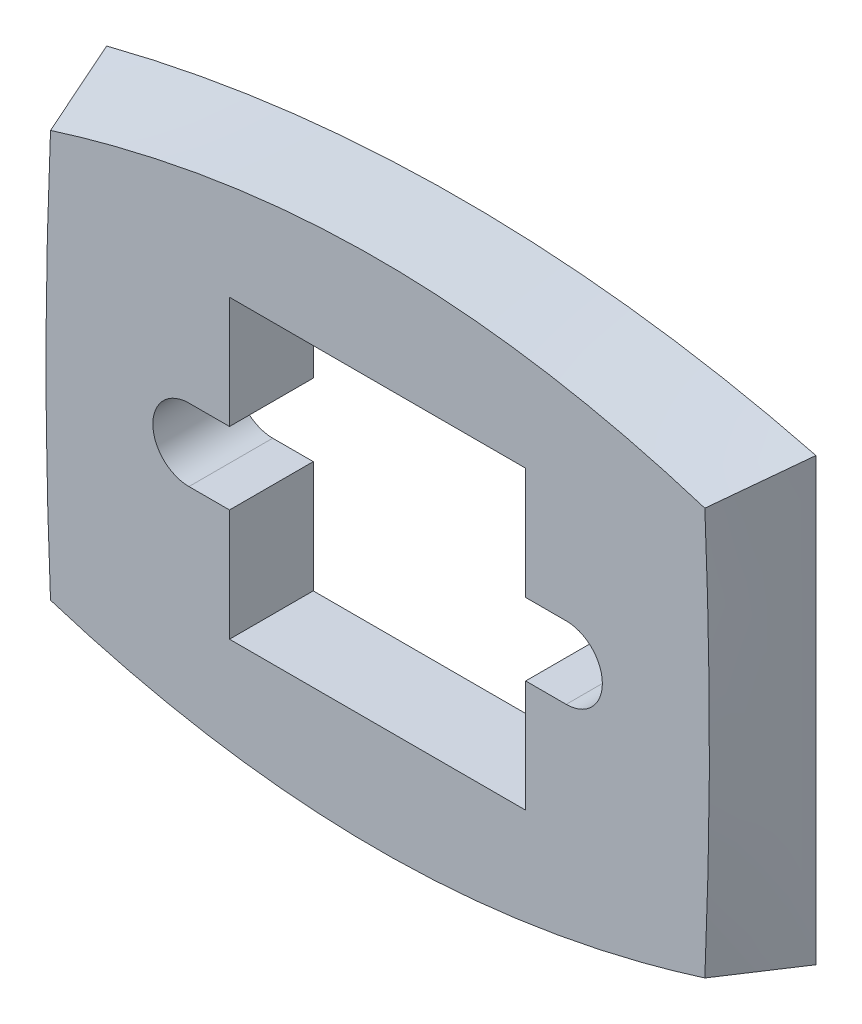
ISO-10303-21;
HEADER;
FILE_DESCRIPTION(('STEP AP214'),'2;1');
FILE_NAME('part.step','',(''),(''),'','','');
FILE_SCHEMA(('AUTOMOTIVE_DESIGN { 1 0 10303 214 1 1 1 1 }'));
ENDSEC;
DATA;
#1=APPLICATION_CONTEXT('core data for automotive mechanical design processes');
#2=APPLICATION_PROTOCOL_DEFINITION('international standard','automotive_design',2000,#1);
#3=PRODUCT_CONTEXT('',#1,'mechanical');
#4=PRODUCT('Part','Part','',(#3));
#5=PRODUCT_RELATED_PRODUCT_CATEGORY('part','',(#4));
#6=PRODUCT_DEFINITION_FORMATION('','',#4);
#7=PRODUCT_DEFINITION_CONTEXT('part definition',#1,'design');
#8=PRODUCT_DEFINITION('design','',#6,#7);
#9=PRODUCT_DEFINITION_SHAPE('','',#8);
#10=(LENGTH_UNIT() NAMED_UNIT(*) SI_UNIT(.MILLI.,.METRE.));
#11=(NAMED_UNIT(*) PLANE_ANGLE_UNIT() SI_UNIT($,.RADIAN.));
#12=(NAMED_UNIT(*) SI_UNIT($,.STERADIAN.) SOLID_ANGLE_UNIT());
#13=UNCERTAINTY_MEASURE_WITH_UNIT(LENGTH_MEASURE(1.E-05),#10,'distance_accuracy_value','');
#14=(GEOMETRIC_REPRESENTATION_CONTEXT(3) GLOBAL_UNCERTAINTY_ASSIGNED_CONTEXT((#13)) GLOBAL_UNIT_ASSIGNED_CONTEXT((#10,
#11,#12)) REPRESENTATION_CONTEXT('',''));
#15=CARTESIAN_POINT('',(0.,0.,0.));
#16=DIRECTION('',(0.,0.,1.));
#17=DIRECTION('',(1.,0.,0.));
#18=AXIS2_PLACEMENT_3D('',#15,#16,#17);
#19=CARTESIAN_POINT('',(0.,65.883028,0.));
#20=DIRECTION('',(0.,0.,1.));
#21=DIRECTION('',(1.,0.,0.));
#22=AXIS2_PLACEMENT_3D('',#19,#20,#21);
#23=PLANE('',#22);
#24=DIRECTION('',(-1.,0.,0.));
#25=VECTOR('',#24,1.);
#26=CARTESIAN_POINT('',(-39.2238839683323,-2.05000000000002,0.));
#27=LINE('',#26,#25);
#28=CARTESIAN_POINT('',(10.7,-2.05000000000002,0.));
#29=VERTEX_POINT('',#28);
#30=CARTESIAN_POINT('',(8.39999999999998,-2.05000000000002,0.));
#31=VERTEX_POINT('',#30);
#32=EDGE_CURVE('E417',#29,#31,#27,.T.);
#33=ORIENTED_EDGE('',*,*,#32,.F.);
#34=CARTESIAN_POINT('',(10.7,0.,0.));
#35=DIRECTION('',(0.,0.,-1.));
#36=DIRECTION('',(-1.,0.,0.));
#37=AXIS2_PLACEMENT_3D('',#34,#35,#36);
#38=CIRCLE('',#37,2.05);
#39=CARTESIAN_POINT('',(10.7,2.04999999999998,0.));
#40=VERTEX_POINT('',#39);
#41=EDGE_CURVE('E418',#40,#29,#38,.T.);
#42=ORIENTED_EDGE('',*,*,#41,.F.);
#43=DIRECTION('',(1.,0.,0.));
#44=VECTOR('',#43,1.);
#45=CARTESIAN_POINT('',(-39.2238839683323,2.04999999999998,0.));
#46=LINE('',#45,#44);
#47=CARTESIAN_POINT('',(8.39999999999998,2.04999999999998,0.));
#48=VERTEX_POINT('',#47);
#49=EDGE_CURVE('E230',#48,#40,#46,.T.);
#50=ORIENTED_EDGE('',*,*,#49,.F.);
#51=DIRECTION('',(0.,-1.,0.));
#52=VECTOR('',#51,1.);
#53=CARTESIAN_POINT('',(8.39999999999998,0.,0.));
#54=LINE('',#53,#52);
#55=CARTESIAN_POINT('',(8.39999999999997,8.39999999999998,0.));
#56=VERTEX_POINT('',#55);
#57=EDGE_CURVE('E119',#56,#48,#54,.T.);
#58=ORIENTED_EDGE('',*,*,#57,.F.);
#59=DIRECTION('',(1.,0.,0.));
#60=VECTOR('',#59,1.);
#61=CARTESIAN_POINT('',(-39.2238839683323,8.39999999999998,0.));
#62=LINE('',#61,#60);
#63=CARTESIAN_POINT('',(-8.40000000000003,8.39999999999998,0.));
#64=VERTEX_POINT('',#63);
#65=EDGE_CURVE('E235',#64,#56,#62,.T.);
#66=ORIENTED_EDGE('',*,*,#65,.F.);
#67=DIRECTION('',(0.,1.,0.));
#68=VECTOR('',#67,1.);
#69=CARTESIAN_POINT('',(-8.40000000000003,0.,0.));
#70=LINE('',#69,#68);
#71=CARTESIAN_POINT('',(-8.40000000000003,2.04999999999998,0.));
#72=VERTEX_POINT('',#71);
#73=EDGE_CURVE('E444',#72,#64,#70,.T.);
#74=ORIENTED_EDGE('',*,*,#73,.F.);
#75=DIRECTION('',(1.,0.,0.));
#76=VECTOR('',#75,1.);
#77=CARTESIAN_POINT('',(-39.2238839683323,2.04999999999998,0.));
#78=LINE('',#77,#76);
#79=CARTESIAN_POINT('',(-10.7,2.04999999999998,0.));
#80=VERTEX_POINT('',#79);
#81=EDGE_CURVE('E441',#80,#72,#78,.T.);
#82=ORIENTED_EDGE('',*,*,#81,.F.);
#83=CARTESIAN_POINT('',(-10.7,0.,0.));
#84=DIRECTION('',(0.,0.,-1.));
#85=DIRECTION('',(-1.,0.,0.));
#86=AXIS2_PLACEMENT_3D('',#83,#84,#85);
#87=CIRCLE('',#86,2.05);
#88=CARTESIAN_POINT('',(-10.7,-2.05000000000002,0.));
#89=VERTEX_POINT('',#88);
#90=EDGE_CURVE('E438',#89,#80,#87,.T.);
#91=ORIENTED_EDGE('',*,*,#90,.F.);
#92=DIRECTION('',(-1.,0.,0.));
#93=VECTOR('',#92,1.);
#94=CARTESIAN_POINT('',(-39.2238839683323,-2.05000000000002,0.));
#95=LINE('',#94,#93);
#96=CARTESIAN_POINT('',(-8.40000000000003,-2.05000000000002,0.));
#97=VERTEX_POINT('',#96);
#98=EDGE_CURVE('E435',#97,#89,#95,.T.);
#99=ORIENTED_EDGE('',*,*,#98,.F.);
#100=DIRECTION('',(0.,1.,0.));
#101=VECTOR('',#100,1.);
#102=CARTESIAN_POINT('',(-8.40000000000003,0.,0.));
#103=LINE('',#102,#101);
#104=CARTESIAN_POINT('',(-8.40000000000003,-8.40000000000002,0.));
#105=VERTEX_POINT('',#104);
#106=EDGE_CURVE('E432',#105,#97,#103,.T.);
#107=ORIENTED_EDGE('',*,*,#106,.F.);
#108=DIRECTION('',(-1.,0.,0.));
#109=VECTOR('',#108,1.);
#110=CARTESIAN_POINT('',(-39.2238839683323,-8.40000000000002,0.));
#111=LINE('',#110,#109);
#112=CARTESIAN_POINT('',(8.39999999999998,-8.40000000000002,0.));
#113=VERTEX_POINT('',#112);
#114=EDGE_CURVE('E425',#113,#105,#111,.T.);
#115=ORIENTED_EDGE('',*,*,#114,.F.);
#116=DIRECTION('',(0.,-1.,0.));
#117=VECTOR('',#116,1.);
#118=CARTESIAN_POINT('',(8.39999999999998,0.,0.));
#119=LINE('',#118,#117);
#120=EDGE_CURVE('E421',#31,#113,#119,.T.);
#121=ORIENTED_EDGE('',*,*,#120,.F.);
#122=EDGE_LOOP('',(#33,#42,#50,#58,#66,#74,#82,#91,#99,#107,#115,#121));
#123=FACE_BOUND('',#122,.T.);
#124=CARTESIAN_POINT('',(0.,65.883028,0.));
#125=DIRECTION('',(0.,0.,1.));
#126=DIRECTION('',(1.,0.,0.));
#127=AXIS2_PLACEMENT_3D('',#124,#125,#126);
#128=CIRCLE('',#127,80.932528);
#129=CARTESIAN_POINT('',(-20.1168,-12.5095,0.));
#130=VERTEX_POINT('',#129);
#131=CARTESIAN_POINT('',(20.1168,-12.5095,0.));
#132=VERTEX_POINT('',#131);
#133=EDGE_CURVE('E266',#130,#132,#128,.T.);
#134=ORIENTED_EDGE('',*,*,#133,.F.);
#135=DIRECTION('',(0.,-1.,0.));
#136=VECTOR('',#135,1.);
#137=CARTESIAN_POINT('',(-20.1168,12.5095,0.));
#138=LINE('',#137,#136);
#139=CARTESIAN_POINT('',(-20.1168,12.5095,0.));
#140=VERTEX_POINT('',#139);
#141=EDGE_CURVE('E13',#140,#130,#138,.T.);
#142=ORIENTED_EDGE('',*,*,#141,.F.);
#143=CARTESIAN_POINT('',(0.,-65.883028,0.));
#144=DIRECTION('',(0.,0.,1.));
#145=DIRECTION('',(-1.,0.,0.));
#146=AXIS2_PLACEMENT_3D('',#143,#144,#145);
#147=CIRCLE('',#146,80.932528);
#148=CARTESIAN_POINT('',(20.1168,12.5095,0.));
#149=VERTEX_POINT('',#148);
#150=EDGE_CURVE('E103',#149,#140,#147,.T.);
#151=ORIENTED_EDGE('',*,*,#150,.F.);
#152=DIRECTION('',(0.,1.,0.));
#153=VECTOR('',#152,1.);
#154=CARTESIAN_POINT('',(20.1168,12.5095,0.));
#155=LINE('',#154,#153);
#156=EDGE_CURVE('E388',#132,#149,#155,.T.);
#157=ORIENTED_EDGE('',*,*,#156,.F.);
#158=EDGE_LOOP('',(#134,#142,#151,#157));
#159=FACE_BOUND('',#158,.T.);
#160=ADVANCED_FACE('F90',(#123,#159),#23,.F.);
#161=CARTESIAN_POINT('',(20.1168,-12.5095,0.));
#162=CARTESIAN_POINT('',(9.74177712979694,-6.17149057386721,31.75));
#163=CARTESIAN_POINT('',(20.1168,-10.4245833333333,0.));
#164=CARTESIAN_POINT('',(10.2730014330366,-5.31721717657622,31.75));
#165=CARTESIAN_POINT('',(20.1168,-8.33966666666667,0.));
#166=CARTESIAN_POINT('',(10.7102668571011,-4.35812536695142,31.75));
#167=CARTESIAN_POINT('',(20.1168,-4.16983333333333,0.));
#168=CARTESIAN_POINT('',(11.3070820380086,-2.31079947243594,31.75));
#169=CARTESIAN_POINT('',(20.1168,-2.08491666666667,0.));
#170=CARTESIAN_POINT('',(11.4654113174126,-1.22365941949708,31.75));
#171=CARTESIAN_POINT('',(20.1168,2.08491666666667,0.));
#172=CARTESIAN_POINT('',(11.4654113174126,0.95235797529623,31.75));
#173=CARTESIAN_POINT('',(20.1168,4.16983333333333,0.));
#174=CARTESIAN_POINT('',(11.3070820380086,2.03949802823509,31.75));
#175=CARTESIAN_POINT('',(20.1168,8.33966666666667,0.));
#176=CARTESIAN_POINT('',(10.7102668571011,4.08682392275058,31.75));
#177=CARTESIAN_POINT('',(20.1168,10.4245833333333,0.));
#178=CARTESIAN_POINT('',(10.2730014330366,5.04591573237537,31.75));
#179=CARTESIAN_POINT('',(20.1168,12.5095,0.));
#180=CARTESIAN_POINT('',(9.74177712979694,5.90018912966637,31.75));
#181=B_SPLINE_SURFACE_WITH_KNOTS('',3,1,((#161,#162),(#163,#164),(#165,#166),(#167,#168),(#169,
#170),(#171,#172),(#173,#174),(#175,#176),(#177,#178),(#179,#180)),.UNSPECIFIED.,.F.,.F.,.F.,(4,
2,2,2,4),(2,2),(0.,0.25,0.5,0.75,1.),(0.,1.),.UNSPECIFIED.);
#182=CARTESIAN_POINT('',(18.564631224142,-11.5612938653812,4.75000000000273));
#183=CARTESIAN_POINT('',(18.6077968784522,-10.5291794533806,4.75000000000273));
#184=CARTESIAN_POINT('',(18.6466142437702,-9.49686397620171,4.75000000000273));
#185=CARTESIAN_POINT('',(18.7137514789873,-7.43188701827835,4.75000000000273));
#186=CARTESIAN_POINT('',(18.7420712701301,-6.39922553499619,4.75000000000273));
#187=CARTESIAN_POINT('',(18.7864124812717,-4.33359354700269,4.75000000000273));
#188=CARTESIAN_POINT('',(18.802433488838,-3.30062303309014,4.75000000000273));
#189=CARTESIAN_POINT('',(18.8167965782259,-1.75108417809327,4.75000000000273));
#190=CARTESIAN_POINT('',(18.8199728680693,-1.23455645716564,4.75000000000273));
#191=CARTESIAN_POINT('',(18.8229804242545,-0.201490517054681,4.75000000000273));
#192=CARTESIAN_POINT('',(18.8228116912909,0.315047702126443,4.75000000000273));
#193=CARTESIAN_POINT('',(18.8188674146513,1.42559784325593,4.75000000000273));
#194=CARTESIAN_POINT('',(18.814554606804,2.0196078596114,4.75000000000273));
#195=CARTESIAN_POINT('',(18.8016944912705,3.20758681900794,4.75000000000273));
#196=CARTESIAN_POINT('',(18.7931471465136,3.8015557616439,4.75000000000273));
#197=CARTESIAN_POINT('',(18.7719215505113,4.98942558348181,4.75000000000273));
#198=CARTESIAN_POINT('',(18.7592432575168,5.58332646193518,4.75000000000273));
#199=CARTESIAN_POINT('',(18.7299521737738,6.77107722866867,4.75000000000273));
#200=CARTESIAN_POINT('',(18.7133390741847,7.36492710928407,4.75000000000273));
#201=CARTESIAN_POINT('',(18.6765559376941,8.55251023680035,4.75000000000273));
#202=CARTESIAN_POINT('',(18.6563859334662,9.14624348472246,4.75000000000273));
#203=CARTESIAN_POINT('',(18.6128327217484,10.333573635653,4.75000000000273));
#204=CARTESIAN_POINT('',(18.5894496158338,10.9271705423775,4.75000000000273));
#205=CARTESIAN_POINT('',(18.564631224142,11.5207054603432,4.75000000000273));
#206=B_SPLINE_CURVE_WITH_KNOTS('',3,(#182,#183,#184,#185,#186,#187,#188,#189,#190,#191,#192,
#193,#194,#195,#196,#197,#198,#199,#200,#201,#202,#203,#204,#205),.UNSPECIFIED.,.F.,.F.,(4,2,2,
2,2,2,2,2,2,2,2,4),(0.,3.09906946394642,6.19816217764374,9.297358813013,10.8469626617805,
12.3965661887083,14.1786272632908,15.9607039389498,17.7427986255727,19.5250332341148,
21.3072514719709,23.0894133817343),.UNSPECIFIED.);
#207=CARTESIAN_POINT('',(18.5646312241419,-11.5612938653812,4.75000000000273));
#208=VERTEX_POINT('',#207);
#209=CARTESIAN_POINT('',(18.564631224142,11.5207054603432,4.75000000000273));
#210=VERTEX_POINT('',#209);
#211=EDGE_CURVE('E317',#208,#210,#206,.T.);
#212=DIRECTION('',(0.305164367738118,-0.186422204889673,-0.933874440268641));
#213=VECTOR('',#212,1.);
#214=CARTESIAN_POINT('',(14.9292885648985,-9.34049528693361,15.875));
#215=LINE('',#214,#213);
#216=EDGE_CURVE('E97',#208,#132,#215,.T.);
#217=DIRECTION('',(-0.304701734454559,-0.194107377972518,0.932458674063906));
#218=VECTOR('',#217,1.);
#219=CARTESIAN_POINT('',(14.9292885648985,9.20484456483318,15.875));
#220=LINE('',#219,#218);
#221=EDGE_CURVE('E344',#149,#210,#220,.T.);
#222=ORIENTED_EDGE('',*,*,#211,.F.);
#223=ORIENTED_EDGE('',*,*,#216,.T.);
#224=ORIENTED_EDGE('',*,*,#156,.T.);
#225=ORIENTED_EDGE('',*,*,#221,.T.);
#226=EDGE_LOOP('',(#222,#223,#224,#225));
#227=FACE_BOUND('',#226,.T.);
#228=ADVANCED_FACE('F324',(#227),#181,.T.);
#229=CARTESIAN_POINT('',(20.1168,12.5095,0.));
#230=CARTESIAN_POINT('',(9.74177712979694,5.90018912966637,31.75));
#231=CARTESIAN_POINT('',(18.4930124180873,12.9261903512516,0.));
#232=CARTESIAN_POINT('',(9.31464043115145,6.58707697804654,31.75));
#233=CARTESIAN_POINT('',(16.8498075331556,13.2938811703234,0.));
#234=CARTESIAN_POINT('',(8.78820102478802,7.27023471741612,31.75));
#235=CARTESIAN_POINT('',(13.5338433716818,13.9275862245964,0.));
#236=CARTESIAN_POINT('',(7.51825047832911,8.55144228399975,31.75));
#237=CARTESIAN_POINT('',(11.8610840951399,14.1936004597975,0.));
#238=CARTESIAN_POINT('',(6.77407182306352,9.14881130915096,31.75));
#239=CARTESIAN_POINT('',(8.49529136487374,14.6202748268178,0.));
#240=CARTESIAN_POINT('',(5.09025789422987,10.1628592043407,31.75));
#241=CARTESIAN_POINT('',(6.80230722698484,14.7809154159909,0.));
#242=CARTESIAN_POINT('',(4.1505771200771,10.5783146371825,31.75));
#243=CARTESIAN_POINT('',(3.40622433916077,14.995528002582,0.));
#244=CARTESIAN_POINT('',(2.15199959526391,11.1445840877516,31.75));
#245=CARTESIAN_POINT('',(1.7031255892256,15.0495,0.));
#246=CARTESIAN_POINT('',(1.09408510748067,11.2943492778996,31.75));
#247=CARTESIAN_POINT('',(-1.70312558922558,15.0495,0.));
#248=CARTESIAN_POINT('',(-1.02326247265551,11.2943492778996,31.75));
#249=CARTESIAN_POINT('',(-3.40622433916074,14.995528002582,0.));
#250=CARTESIAN_POINT('',(-2.08117696043874,11.1445840877516,31.75));
#251=CARTESIAN_POINT('',(-6.80230722698481,14.7809154159909,0.));
#252=CARTESIAN_POINT('',(-4.07975448525194,10.5783146371825,31.75));
#253=CARTESIAN_POINT('',(-8.49529136487372,14.6202748268178,0.));
#254=CARTESIAN_POINT('',(-5.01943525940471,10.1628592043407,31.75));
#255=CARTESIAN_POINT('',(-11.8610840951398,14.1936004597975,0.));
#256=CARTESIAN_POINT('',(-6.70324918823836,9.14881130915096,31.75));
#257=CARTESIAN_POINT('',(-13.5338433716818,13.9275862245964,0.));
#258=CARTESIAN_POINT('',(-7.44742784350395,8.55144228399975,31.75));
#259=CARTESIAN_POINT('',(-16.8498075331555,13.2938811703234,0.));
#260=CARTESIAN_POINT('',(-8.71737838996285,7.27023471741612,31.75));
#261=CARTESIAN_POINT('',(-18.4930124180873,12.9261903512516,0.));
#262=CARTESIAN_POINT('',(-9.24381779632628,6.58707697804654,31.75));
#263=CARTESIAN_POINT('',(-20.1168,12.5095,0.));
#264=CARTESIAN_POINT('',(-9.67095449497178,5.90018912966636,31.75));
#265=B_SPLINE_SURFACE_WITH_KNOTS('',3,1,((#229,#230),(#231,#232),(#233,#234),(#235,#236),(#237,
#238),(#239,#240),(#241,#242),(#243,#244),(#245,#246),(#247,#248),(#249,#250),(#251,#252),(#253,
#254),(#255,#256),(#257,#258),(#259,#260),(#261,#262),(#263,#264)),.UNSPECIFIED.,.F.,.F.,.F.,(4,
2,2,2,2,2,2,2,4),(2,2),(0.,0.125,0.25,0.375,0.5,0.625,0.75,0.875,1.),(0.,1.),.UNSPECIFIED.);
#266=CARTESIAN_POINT('',(18.564631224142,11.5207054603432,4.75000000000273));
#267=CARTESIAN_POINT('',(17.8275200578571,11.7539184513241,4.75000000000273));
#268=CARTESIAN_POINT('',(17.0864777139919,11.9748042837635,4.75000000000273));
#269=CARTESIAN_POINT('',(15.5971349252032,12.3909297096307,4.75000000000273));
#270=CARTESIAN_POINT('',(14.8488336122288,12.5861661941963,4.75000000000273));
#271=CARTESIAN_POINT('',(13.3450659508561,12.9501110337123,4.75000000000273));
#272=CARTESIAN_POINT('',(12.5895936545448,13.1187948665647,4.75000000000273));
#273=CARTESIAN_POINT('',(11.0729712246845,13.4282627169368,4.75000000000273));
#274=CARTESIAN_POINT('',(10.3118212929182,13.5690477211229,4.75000000000273));
#275=CARTESIAN_POINT('',(8.78423668339053,13.8215610063246,4.75000000000273));
#276=CARTESIAN_POINT('',(8.01779910494693,13.9332717768893,4.75000000000273));
#277=CARTESIAN_POINT('',(6.48115580641958,14.1267861818075,4.75000000000273));
#278=CARTESIAN_POINT('',(5.71095012323263,14.2085901084133,4.75000000000273));
#279=CARTESIAN_POINT('',(4.16821617619416,14.3413293261594,4.75000000000273));
#280=CARTESIAN_POINT('',(3.39568907560175,14.3922781036675,4.75000000000273));
#281=CARTESIAN_POINT('',(1.84921010155733,14.4630737398562,4.75000000000273));
#282=CARTESIAN_POINT('',(1.07525823471207,14.4829207423961,4.75000000000273));
#283=CARTESIAN_POINT('',(-0.487061322910144,14.491021393756,4.75000000000273));
#284=CARTESIAN_POINT('',(-1.2754321599094,14.4786868313375,4.75000000000273));
#285=CARTESIAN_POINT('',(-2.85099893794842,14.4216458069209,4.75000000000273));
#286=CARTESIAN_POINT('',(-3.63819486787022,14.3769390405111,4.75000000000273));
#287=CARTESIAN_POINT('',(-5.21049695720436,14.25541041808,4.75000000000273));
#288=CARTESIAN_POINT('',(-5.99560191637493,14.1785729795067,4.75000000000273));
#289=CARTESIAN_POINT('',(-7.56205929209016,13.9937134518986,4.75000000000273));
#290=CARTESIAN_POINT('',(-8.34341174176799,13.8856916387261,4.75000000000273));
#291=CARTESIAN_POINT('',(-10.7204128289873,13.509601750268,4.75000000000273));
#292=CARTESIAN_POINT('',(-12.3086464083165,13.1926588163594,4.75000000000273));
#293=CARTESIAN_POINT('',(-14.6686364195713,12.629554259178,4.75000000000273));
#294=CARTESIAN_POINT('',(-15.4512974614651,12.4273255861602,4.75000000000273));
#295=CARTESIAN_POINT('',(-17.008707134582,11.9947925809833,4.75000000000273));
#296=CARTESIAN_POINT('',(-17.7834568902863,11.7644923007556,4.75000000000273));
#297=CARTESIAN_POINT('',(-18.5540357118453,11.5207054603432,4.75000000000273));
#298=B_SPLINE_CURVE_WITH_KNOTS('',3,(#266,#267,#268,#269,#270,#271,#272,#273,#274,#275,#276,
#277,#278,#279,#280,#281,#282,#283,#284,#285,#286,#287,#288,#289,#290,#291,#292,#293,#294,#295,
#296,#297),.UNSPECIFIED.,.F.,.F.,(4,2,2,2,2,2,2,2,2,2,2,2,2,2,2,4),(0.,2.31930837612746,
4.63889760817523,6.96061663247249,9.28225353249531,11.6052854589492,13.9282946839176,
16.2502878188129,18.572270213442,20.9369895926734,23.3017312088155,25.6676209965264,
28.0334898558168,32.8863372178685,35.31102937775,37.7353719645581),.UNSPECIFIED.);
#299=CARTESIAN_POINT('',(-18.5540357118453,11.5207054603432,4.75000000000273));
#300=VERTEX_POINT('',#299);
#301=EDGE_CURVE('E111',#210,#300,#298,.T.);
#302=DIRECTION('',(0.306586801344813,-0.193984055943935,0.931866256112269));
#303=VECTOR('',#302,1.);
#304=CARTESIAN_POINT('',(-14.8938772474859,9.20484456483319,15.875));
#305=LINE('',#304,#303);
#306=EDGE_CURVE('E247',#140,#300,#305,.T.);
#307=ORIENTED_EDGE('',*,*,#301,.F.);
#308=ORIENTED_EDGE('',*,*,#221,.F.);
#309=ORIENTED_EDGE('',*,*,#150,.T.);
#310=ORIENTED_EDGE('',*,*,#306,.T.);
#311=EDGE_LOOP('',(#307,#308,#309,#310));
#312=FACE_BOUND('',#311,.T.);
#313=ADVANCED_FACE('F282',(#312),#265,.T.);
#314=CARTESIAN_POINT('',(-20.1168,-12.5095,0.));
#315=CARTESIAN_POINT('',(-9.67095449497178,-6.17149057386721,31.75));
#316=CARTESIAN_POINT('',(-18.4930124180873,-12.9261903512516,0.));
#317=CARTESIAN_POINT('',(-9.24381779632628,-6.85837842224738,31.75));
#318=CARTESIAN_POINT('',(-16.8498075331556,-13.2938811703234,0.));
#319=CARTESIAN_POINT('',(-8.71737838996286,-7.54153616161697,31.75));
#320=CARTESIAN_POINT('',(-13.5338433716818,-13.9275862245964,0.));
#321=CARTESIAN_POINT('',(-7.44742784350395,-8.82274372820059,31.75));
#322=CARTESIAN_POINT('',(-11.8610840951399,-14.1936004597975,0.));
#323=CARTESIAN_POINT('',(-6.70324918823836,-9.4201127533518,31.75));
#324=CARTESIAN_POINT('',(-8.49529136487374,-14.6202748268178,0.));
#325=CARTESIAN_POINT('',(-5.01943525940471,-10.4341606485416,31.75));
#326=CARTESIAN_POINT('',(-6.80230722698484,-14.7809154159909,0.));
#327=CARTESIAN_POINT('',(-4.07975448525194,-10.8496160813833,31.75));
#328=CARTESIAN_POINT('',(-3.40622433916077,-14.995528002582,0.));
#329=CARTESIAN_POINT('',(-2.08117696043875,-11.4158855319524,31.75));
#330=CARTESIAN_POINT('',(-1.7031255892256,-15.0495,0.));
#331=CARTESIAN_POINT('',(-1.02326247265551,-11.5656507221004,31.75));
#332=CARTESIAN_POINT('',(1.70312558922558,-15.0495,0.));
#333=CARTESIAN_POINT('',(1.09408510748067,-11.5656507221004,31.75));
#334=CARTESIAN_POINT('',(3.40622433916074,-14.995528002582,0.));
#335=CARTESIAN_POINT('',(2.15199959526391,-11.4158855319524,31.75));
#336=CARTESIAN_POINT('',(6.80230722698481,-14.7809154159909,0.));
#337=CARTESIAN_POINT('',(4.1505771200771,-10.8496160813833,31.75));
#338=CARTESIAN_POINT('',(8.49529136487372,-14.6202748268178,0.));
#339=CARTESIAN_POINT('',(5.09025789422987,-10.4341606485416,31.75));
#340=CARTESIAN_POINT('',(11.8610840951398,-14.1936004597975,0.));
#341=CARTESIAN_POINT('',(6.77407182306352,-9.4201127533518,31.75));
#342=CARTESIAN_POINT('',(13.5338433716818,-13.9275862245964,0.));
#343=CARTESIAN_POINT('',(7.51825047832911,-8.82274372820059,31.75));
#344=CARTESIAN_POINT('',(16.8498075331555,-13.2938811703234,0.));
#345=CARTESIAN_POINT('',(8.78820102478802,-7.54153616161697,31.75));
#346=CARTESIAN_POINT('',(18.4930124180873,-12.9261903512516,0.));
#347=CARTESIAN_POINT('',(9.31464043115144,-6.85837842224738,31.75));
#348=CARTESIAN_POINT('',(20.1168,-12.5095,0.));
#349=CARTESIAN_POINT('',(9.74177712979694,-6.17149057386721,31.75));
#350=B_SPLINE_SURFACE_WITH_KNOTS('',3,1,((#314,#315),(#316,#317),(#318,#319),(#320,#321),(#322,
#323),(#324,#325),(#326,#327),(#328,#329),(#330,#331),(#332,#333),(#334,#335),(#336,#337),(#338,
#339),(#340,#341),(#342,#343),(#344,#345),(#346,#347),(#348,#349)),.UNSPECIFIED.,.F.,.F.,.F.,(4,
2,2,2,2,2,2,2,4),(2,2),(0.,0.125,0.25,0.375,0.5,0.625,0.75,0.875,1.),(0.,1.),.UNSPECIFIED.);
#351=CARTESIAN_POINT('',(-18.5540357118453,-11.5612938653812,4.75000000000273));
#352=CARTESIAN_POINT('',(-17.8233169194861,-11.7924850225091,4.75000000000273));
#353=CARTESIAN_POINT('',(-17.0887351627284,-12.0115609534267,4.75000000000273));
#354=CARTESIAN_POINT('',(-15.6124347450893,-12.4245174671723,4.75000000000273));
#355=CARTESIAN_POINT('',(-14.8707152540386,-12.6183950802683,4.75000000000273));
#356=CARTESIAN_POINT('',(-13.3802303856273,-12.9800978424452,4.75000000000273));
#357=CARTESIAN_POINT('',(-12.6314592678419,-13.1478993876373,4.75000000000273));
#358=CARTESIAN_POINT('',(-11.1283163883859,-13.4561167932441,4.75000000000273));
#359=CARTESIAN_POINT('',(-10.3739448190015,-13.5965335894151,4.75000000000273));
#360=CARTESIAN_POINT('',(-8.85998402464088,-13.8488484505324,4.75000000000273));
#361=CARTESIAN_POINT('',(-8.10039201412665,-13.9607298410182,4.75000000000273));
#362=CARTESIAN_POINT('',(-6.57746352926412,-14.1551367662752,4.75000000000273));
#363=CARTESIAN_POINT('',(-5.81412709013188,-14.2376625765985,4.75000000000273));
#364=CARTESIAN_POINT('',(-4.28508614544061,-14.3724189203239,4.75000000000273));
#365=CARTESIAN_POINT('',(-3.51938277943757,-14.424662266706,4.75000000000273));
#366=CARTESIAN_POINT('',(-1.98656604770286,-14.4986032946394,4.75000000000273));
#367=CARTESIAN_POINT('',(-1.21945268434627,-14.5203010275964,4.75000000000273));
#368=CARTESIAN_POINT('',(1.13715098434705,-14.5391896086152,4.75000000000273));
#369=CARTESIAN_POINT('',(2.72746852481496,-14.4852429730138,4.75000000000273));
#370=CARTESIAN_POINT('',(5.10531533185089,-14.3064978612982,4.75000000000273));
#371=CARTESIAN_POINT('',(5.89694323911155,-14.2305669511613,4.75000000000273));
#372=CARTESIAN_POINT('',(7.47651096546663,-14.0469563070214,4.75000000000273));
#373=CARTESIAN_POINT('',(8.26445081994683,-13.9392768782731,4.75000000000273));
#374=CARTESIAN_POINT('',(10.6622269150728,-13.5632953831502,4.75000000000273));
#375=CARTESIAN_POINT('',(12.2645586866374,-13.2451972812407,4.75000000000273));
#376=CARTESIAN_POINT('',(14.6453514285863,-12.6787552415326,4.75000000000273));
#377=CARTESIAN_POINT('',(15.4348828558376,-12.4751486855152,4.75000000000273));
#378=CARTESIAN_POINT('',(17.0059006277914,-12.0393624547604,4.75000000000273));
#379=CARTESIAN_POINT('',(17.7873881463196,-11.8071870149442,4.75000000000273));
#380=CARTESIAN_POINT('',(18.5646312241419,-11.5612938653812,4.75000000000273));
#381=B_SPLINE_CURVE_WITH_KNOTS('',3,(#351,#352,#353,#354,#355,#356,#357,#358,#359,#360,#361,
#362,#363,#364,#365,#366,#367,#368,#369,#370,#371,#372,#373,#374,#375,#376,#377,#378,#379,#380),
.UNSPECIFIED.,.F.,.F.,(4,2,2,2,2,2,2,2,2,2,2,2,2,2,4),(0.,2.29919599511103,4.59866271529065,
6.90019892333288,9.2016564724693,11.5044557965628,13.8072335043781,16.1090361586641,
18.4108349392043,23.1779387073566,25.563210291634,27.9484589428203,32.8433408906443,
35.2890099927295,37.7343169957119),.UNSPECIFIED.);
#382=CARTESIAN_POINT('',(-18.5540357118453,-11.5612938653812,4.75000000000273));
#383=VERTEX_POINT('',#382);
#384=EDGE_CURVE('E294',#383,#208,#381,.T.);
#385=DIRECTION('',(0.307051704111022,0.186303405887921,0.933279321509417));
#386=VECTOR('',#385,1.);
#387=CARTESIAN_POINT('',(-14.8938772474859,-9.3404952869336,15.875));
#388=LINE('',#387,#386);
#389=EDGE_CURVE('E255',#130,#383,#388,.T.);
#390=ORIENTED_EDGE('',*,*,#384,.F.);
#391=ORIENTED_EDGE('',*,*,#389,.F.);
#392=ORIENTED_EDGE('',*,*,#133,.T.);
#393=ORIENTED_EDGE('',*,*,#216,.F.);
#394=EDGE_LOOP('',(#390,#391,#392,#393));
#395=FACE_BOUND('',#394,.T.);
#396=ADVANCED_FACE('F271',(#395),#350,.T.);
#397=CARTESIAN_POINT('',(-20.1168,12.5095,0.));
#398=CARTESIAN_POINT('',(-9.67095449497178,5.90018912966637,31.75));
#399=CARTESIAN_POINT('',(-20.1168,10.4245833333333,0.));
#400=CARTESIAN_POINT('',(-10.2021787982114,5.04591573237538,31.75));
#401=CARTESIAN_POINT('',(-20.1168,8.33966666666667,0.));
#402=CARTESIAN_POINT('',(-10.639444222276,4.08682392275058,31.75));
#403=CARTESIAN_POINT('',(-20.1168,4.16983333333334,0.));
#404=CARTESIAN_POINT('',(-11.2362594031835,2.03949802823509,31.75));
#405=CARTESIAN_POINT('',(-20.1168,2.08491666666667,0.));
#406=CARTESIAN_POINT('',(-11.3945886825874,0.952357975296231,31.75));
#407=CARTESIAN_POINT('',(-20.1168,-2.08491666666666,0.));
#408=CARTESIAN_POINT('',(-11.3945886825874,-1.22365941949707,31.75));
#409=CARTESIAN_POINT('',(-20.1168,-4.16983333333333,0.));
#410=CARTESIAN_POINT('',(-11.2362594031835,-2.31079947243593,31.75));
#411=CARTESIAN_POINT('',(-20.1168,-8.33966666666667,0.));
#412=CARTESIAN_POINT('',(-10.639444222276,-4.35812536695142,31.75));
#413=CARTESIAN_POINT('',(-20.1168,-10.4245833333333,0.));
#414=CARTESIAN_POINT('',(-10.2021787982114,-5.31721717657622,31.75));
#415=CARTESIAN_POINT('',(-20.1168,-12.5095,0.));
#416=CARTESIAN_POINT('',(-9.67095449497178,-6.17149057386721,31.75));
#417=B_SPLINE_SURFACE_WITH_KNOTS('',3,1,((#397,#398),(#399,#400),(#401,#402),(#403,#404),(#405,
#406),(#407,#408),(#409,#410),(#411,#412),(#413,#414),(#415,#416)),.UNSPECIFIED.,.F.,.F.,.F.,(4,
2,2,2,4),(2,2),(0.,0.25,0.5,0.75,1.),(0.,1.),.UNSPECIFIED.);
#418=CARTESIAN_POINT('',(-18.5540357118453,11.5207054603432,4.75000000000273));
#419=CARTESIAN_POINT('',(-18.5970281876214,10.4926882156779,4.75000000000273));
#420=CARTESIAN_POINT('',(-18.6357094851761,9.46447173195861,4.75000000000273));
#421=CARTESIAN_POINT('',(-18.7026650106894,7.40769519924594,4.75000000000273));
#422=CARTESIAN_POINT('',(-18.7309391599502,6.37913514771341,4.75000000000273));
#423=CARTESIAN_POINT('',(-18.7752957075961,4.32170779996954,4.75000000000273));
#424=CARTESIAN_POINT('',(-18.7913777013186,3.29284049469404,4.75000000000273));
#425=CARTESIAN_POINT('',(-18.8059139258843,1.74945572146611,4.75000000000273));
#426=CARTESIAN_POINT('',(-18.8091615370464,1.2349792657791,4.75000000000273));
#427=CARTESIAN_POINT('',(-18.8123415126758,0.206015354319275,4.75000000000273));
#428=CARTESIAN_POINT('',(-18.8122738777894,-0.308472101451384,4.75000000000273));
#429=CARTESIAN_POINT('',(-18.8085544174505,-1.41970573835852,4.75000000000273));
#430=CARTESIAN_POINT('',(-18.8043311809399,-2.01645001622734,4.75000000000273));
#431=CARTESIAN_POINT('',(-18.7916080299876,-3.20989783363619,4.75000000000273));
#432=CARTESIAN_POINT('',(-18.7831080774505,-3.80660137276597,4.75000000000273));
#433=CARTESIAN_POINT('',(-18.7619374434496,-4.99994031712874,4.75000000000273));
#434=CARTESIAN_POINT('',(-18.749266719304,-5.59657572160195,4.75000000000273));
#435=CARTESIAN_POINT('',(-18.7199495215519,-6.78979607233033,4.75000000000273));
#436=CARTESIAN_POINT('',(-18.7033027293475,-7.38638101070764,4.75000000000273));
#437=CARTESIAN_POINT('',(-18.6664161623856,-8.57943322224709,4.75000000000273));
#438=CARTESIAN_POINT('',(-18.646176421041,-9.17590049645184,4.75000000000273));
#439=CARTESIAN_POINT('',(-18.6024524676394,-10.3686973263036,4.75000000000273));
#440=CARTESIAN_POINT('',(-18.5789683593806,-10.9650268857454,4.75000000000273));
#441=CARTESIAN_POINT('',(-18.5540357118453,-11.5612938653812,4.75000000000273));
#442=B_SPLINE_CURVE_WITH_KNOTS('',3,(#418,#419,#420,#421,#422,#423,#424,#425,#426,#427,#428,
#429,#430,#431,#432,#433,#434,#435,#436,#437,#438,#439,#440,#441),.UNSPECIFIED.,.F.,.F.,(4,2,2,
2,2,2,2,2,2,2,2,4),(0.,3.08676670811456,6.17355675761948,9.26044925448973,10.8039008749255,
12.3473521944111,14.1376136301731,15.9278910131871,17.7181867176883,19.5086259246855,
21.2990484821884,23.0894137713305),.UNSPECIFIED.);
#443=EDGE_CURVE('E301',#300,#383,#442,.T.);
#444=ORIENTED_EDGE('',*,*,#443,.F.);
#445=ORIENTED_EDGE('',*,*,#306,.F.);
#446=ORIENTED_EDGE('',*,*,#141,.T.);
#447=ORIENTED_EDGE('',*,*,#389,.T.);
#448=EDGE_LOOP('',(#444,#445,#446,#447));
#449=FACE_BOUND('',#448,.T.);
#450=ADVANCED_FACE('F92',(#449),#417,.T.);
#451=CARTESIAN_POINT('',(10.7,0.,35.286699232238));
#452=DIRECTION('',(0.,0.,-1.));
#453=DIRECTION('',(-1.,0.,0.));
#454=AXIS2_PLACEMENT_3D('',#451,#452,#453);
#455=CYLINDRICAL_SURFACE('',#454,2.05);
#456=DIRECTION('',(0.,0.,-1.));
#457=VECTOR('',#456,1.);
#458=CARTESIAN_POINT('',(10.7,2.04999999999998,35.286699232238));
#459=LINE('',#458,#457);
#460=CARTESIAN_POINT('',(10.7,2.04999999999998,4.75000000000273));
#461=VERTEX_POINT('',#460);
#462=EDGE_CURVE('E223',#461,#40,#459,.T.);
#463=ORIENTED_EDGE('',*,*,#462,.T.);
#464=ORIENTED_EDGE('',*,*,#41,.T.);
#465=DIRECTION('',(0.,0.,-1.));
#466=VECTOR('',#465,1.);
#467=CARTESIAN_POINT('',(10.7,-2.05000000000002,35.286699232238));
#468=LINE('',#467,#466);
#469=CARTESIAN_POINT('',(10.7,-2.05000000000002,4.75000000000273));
#470=VERTEX_POINT('',#469);
#471=EDGE_CURVE('E225',#470,#29,#468,.T.);
#472=ORIENTED_EDGE('',*,*,#471,.F.);
#473=CARTESIAN_POINT('',(10.7,0.,4.75000000000273));
#474=DIRECTION('',(0.,0.,1.));
#475=DIRECTION('',(-1.,0.,0.));
#476=AXIS2_PLACEMENT_3D('',#473,#474,#475);
#477=CIRCLE('',#476,2.05);
#478=EDGE_CURVE('E212',#470,#461,#477,.T.);
#479=ORIENTED_EDGE('',*,*,#478,.T.);
#480=EDGE_LOOP('',(#463,#464,#472,#479));
#481=FACE_BOUND('',#480,.T.);
#482=ADVANCED_FACE('F221',(#481),#455,.F.);
#483=CARTESIAN_POINT('',(-39.2238839683323,-2.05000000000002,35.286699232238));
#484=DIRECTION('',(0.,-1.,0.));
#485=DIRECTION('',(0.,0.,-1.));
#486=AXIS2_PLACEMENT_3D('',#483,#484,#485);
#487=PLANE('',#486);
#488=ORIENTED_EDGE('',*,*,#471,.T.);
#489=ORIENTED_EDGE('',*,*,#32,.T.);
#490=DIRECTION('',(0.,0.,-1.));
#491=VECTOR('',#490,1.);
#492=CARTESIAN_POINT('',(8.39999999999998,-2.05000000000002,35.286699232238));
#493=LINE('',#492,#491);
#494=CARTESIAN_POINT('',(8.39999999999998,-2.05000000000001,4.75000000000273));
#495=VERTEX_POINT('',#494);
#496=EDGE_CURVE('E233',#495,#31,#493,.T.);
#497=ORIENTED_EDGE('',*,*,#496,.F.);
#498=DIRECTION('',(1.,0.,0.));
#499=VECTOR('',#498,1.);
#500=CARTESIAN_POINT('',(10.7,-2.05000000000001,4.75000000000273));
#501=LINE('',#500,#499);
#502=EDGE_CURVE('E226',#495,#470,#501,.T.);
#503=ORIENTED_EDGE('',*,*,#502,.T.);
#504=EDGE_LOOP('',(#488,#489,#497,#503));
#505=FACE_BOUND('',#504,.T.);
#506=ADVANCED_FACE('F407',(#505),#487,.F.);
#507=CARTESIAN_POINT('',(8.39999999999998,0.,35.286699232238));
#508=DIRECTION('',(1.,0.,0.));
#509=DIRECTION('',(0.,1.,0.));
#510=AXIS2_PLACEMENT_3D('',#507,#508,#509);
#511=PLANE('',#510);
#512=ORIENTED_EDGE('',*,*,#496,.T.);
#513=ORIENTED_EDGE('',*,*,#120,.T.);
#514=DIRECTION('',(0.,0.,-1.));
#515=VECTOR('',#514,1.);
#516=CARTESIAN_POINT('',(8.39999999999998,-8.40000000000002,35.286699232238));
#517=LINE('',#516,#515);
#518=CARTESIAN_POINT('',(8.40000000000003,-8.40000000000002,4.75000000000273));
#519=VERTEX_POINT('',#518);
#520=EDGE_CURVE('E464',#519,#113,#517,.T.);
#521=ORIENTED_EDGE('',*,*,#520,.F.);
#522=DIRECTION('',(0.,1.,0.));
#523=VECTOR('',#522,1.);
#524=CARTESIAN_POINT('',(8.40000000000003,-2.05000000000001,4.75000000000273));
#525=LINE('',#524,#523);
#526=EDGE_CURVE('E469',#519,#495,#525,.T.);
#527=ORIENTED_EDGE('',*,*,#526,.T.);
#528=EDGE_LOOP('',(#512,#513,#521,#527));
#529=FACE_BOUND('',#528,.T.);
#530=ADVANCED_FACE('F467',(#529),#511,.F.);
#531=CARTESIAN_POINT('',(-39.2238839683323,-8.40000000000002,35.286699232238));
#532=DIRECTION('',(0.,-1.,0.));
#533=DIRECTION('',(0.,0.,-1.));
#534=AXIS2_PLACEMENT_3D('',#531,#532,#533);
#535=PLANE('',#534);
#536=ORIENTED_EDGE('',*,*,#520,.T.);
#537=ORIENTED_EDGE('',*,*,#114,.T.);
#538=DIRECTION('',(0.,0.,-1.));
#539=VECTOR('',#538,1.);
#540=CARTESIAN_POINT('',(-8.40000000000003,-8.40000000000002,35.286699232238));
#541=LINE('',#540,#539);
#542=CARTESIAN_POINT('',(-8.40000000000003,-8.40000000000002,4.75000000000273));
#543=VERTEX_POINT('',#542);
#544=EDGE_CURVE('E462',#543,#105,#541,.T.);
#545=ORIENTED_EDGE('',*,*,#544,.F.);
#546=DIRECTION('',(1.,0.,0.));
#547=VECTOR('',#546,1.);
#548=CARTESIAN_POINT('',(8.40000000000003,-8.40000000000001,4.75000000000273));
#549=LINE('',#548,#547);
#550=EDGE_CURVE('E322',#543,#519,#549,.T.);
#551=ORIENTED_EDGE('',*,*,#550,.T.);
#552=EDGE_LOOP('',(#536,#537,#545,#551));
#553=FACE_BOUND('',#552,.T.);
#554=ADVANCED_FACE('F496',(#553),#535,.F.);
#555=CARTESIAN_POINT('',(-8.40000000000003,0.,35.286699232238));
#556=DIRECTION('',(-1.,0.,0.));
#557=DIRECTION('',(0.,-1.,0.));
#558=AXIS2_PLACEMENT_3D('',#555,#556,#557);
#559=PLANE('',#558);
#560=ORIENTED_EDGE('',*,*,#544,.T.);
#561=ORIENTED_EDGE('',*,*,#106,.T.);
#562=DIRECTION('',(0.,0.,-1.));
#563=VECTOR('',#562,1.);
#564=CARTESIAN_POINT('',(-8.40000000000003,-2.05000000000002,35.286699232238));
#565=LINE('',#564,#563);
#566=CARTESIAN_POINT('',(-8.39999999999998,-2.05000000000002,4.75000000000273));
#567=VERTEX_POINT('',#566);
#568=EDGE_CURVE('E460',#567,#97,#565,.T.);
#569=ORIENTED_EDGE('',*,*,#568,.F.);
#570=DIRECTION('',(0.,-1.,0.));
#571=VECTOR('',#570,1.);
#572=CARTESIAN_POINT('',(-8.39999999999997,-2.05000000000001,4.75000000000273));
#573=LINE('',#572,#571);
#574=EDGE_CURVE('E488',#567,#543,#573,.T.);
#575=ORIENTED_EDGE('',*,*,#574,.T.);
#576=EDGE_LOOP('',(#560,#561,#569,#575));
#577=FACE_BOUND('',#576,.T.);
#578=ADVANCED_FACE('F493',(#577),#559,.F.);
#579=CARTESIAN_POINT('',(-39.2238839683323,-2.05000000000002,35.286699232238));
#580=DIRECTION('',(0.,-1.,0.));
#581=DIRECTION('',(0.,0.,-1.));
#582=AXIS2_PLACEMENT_3D('',#579,#580,#581);
#583=PLANE('',#582);
#584=ORIENTED_EDGE('',*,*,#568,.T.);
#585=ORIENTED_EDGE('',*,*,#98,.T.);
#586=DIRECTION('',(0.,0.,-1.));
#587=VECTOR('',#586,1.);
#588=CARTESIAN_POINT('',(-10.7,-2.05000000000002,35.286699232238));
#589=LINE('',#588,#587);
#590=CARTESIAN_POINT('',(-10.7,-2.05000000000002,4.75000000000273));
#591=VERTEX_POINT('',#590);
#592=EDGE_CURVE('E458',#591,#89,#589,.T.);
#593=ORIENTED_EDGE('',*,*,#592,.F.);
#594=DIRECTION('',(1.,0.,0.));
#595=VECTOR('',#594,1.);
#596=CARTESIAN_POINT('',(-10.7,-2.05000000000001,4.75000000000273));
#597=LINE('',#596,#595);
#598=EDGE_CURVE('E485',#591,#567,#597,.T.);
#599=ORIENTED_EDGE('',*,*,#598,.T.);
#600=EDGE_LOOP('',(#584,#585,#593,#599));
#601=FACE_BOUND('',#600,.T.);
#602=ADVANCED_FACE('F503',(#601),#583,.F.);
#603=CARTESIAN_POINT('',(-10.7,0.,35.286699232238));
#604=DIRECTION('',(0.,0.,-1.));
#605=DIRECTION('',(-1.,0.,0.));
#606=AXIS2_PLACEMENT_3D('',#603,#604,#605);
#607=CYLINDRICAL_SURFACE('',#606,2.05);
#608=ORIENTED_EDGE('',*,*,#592,.T.);
#609=ORIENTED_EDGE('',*,*,#90,.T.);
#610=DIRECTION('',(0.,0.,-1.));
#611=VECTOR('',#610,1.);
#612=CARTESIAN_POINT('',(-10.7,2.04999999999998,35.286699232238));
#613=LINE('',#612,#611);
#614=CARTESIAN_POINT('',(-10.7,2.04999999999998,4.75000000000273));
#615=VERTEX_POINT('',#614);
#616=EDGE_CURVE('E456',#615,#80,#613,.T.);
#617=ORIENTED_EDGE('',*,*,#616,.F.);
#618=CARTESIAN_POINT('',(-10.7,0.,4.75000000000273));
#619=DIRECTION('',(0.,0.,1.));
#620=DIRECTION('',(1.,0.,0.));
#621=AXIS2_PLACEMENT_3D('',#618,#619,#620);
#622=CIRCLE('',#621,2.05);
#623=EDGE_CURVE('E482',#615,#591,#622,.T.);
#624=ORIENTED_EDGE('',*,*,#623,.T.);
#625=EDGE_LOOP('',(#608,#609,#617,#624));
#626=FACE_BOUND('',#625,.T.);
#627=ADVANCED_FACE('F506',(#626),#607,.F.);
#628=CARTESIAN_POINT('',(-39.2238839683323,2.04999999999998,35.286699232238));
#629=DIRECTION('',(0.,1.,0.));
#630=DIRECTION('',(0.,0.,1.));
#631=AXIS2_PLACEMENT_3D('',#628,#629,#630);
#632=PLANE('',#631);
#633=ORIENTED_EDGE('',*,*,#616,.T.);
#634=ORIENTED_EDGE('',*,*,#81,.T.);
#635=DIRECTION('',(0.,0.,-1.));
#636=VECTOR('',#635,1.);
#637=CARTESIAN_POINT('',(-8.40000000000003,2.04999999999998,35.286699232238));
#638=LINE('',#637,#636);
#639=CARTESIAN_POINT('',(-8.40000000000003,2.04999999999998,4.75000000000273));
#640=VERTEX_POINT('',#639);
#641=EDGE_CURVE('E454',#640,#72,#638,.T.);
#642=ORIENTED_EDGE('',*,*,#641,.F.);
#643=DIRECTION('',(-1.,0.,0.));
#644=VECTOR('',#643,1.);
#645=CARTESIAN_POINT('',(-10.7,2.04999999999999,4.75000000000273));
#646=LINE('',#645,#644);
#647=EDGE_CURVE('E479',#640,#615,#646,.T.);
#648=ORIENTED_EDGE('',*,*,#647,.T.);
#649=EDGE_LOOP('',(#633,#634,#642,#648));
#650=FACE_BOUND('',#649,.T.);
#651=ADVANCED_FACE('F508',(#650),#632,.F.);
#652=CARTESIAN_POINT('',(-8.40000000000003,0.,35.286699232238));
#653=DIRECTION('',(-1.,0.,0.));
#654=DIRECTION('',(0.,-1.,0.));
#655=AXIS2_PLACEMENT_3D('',#652,#653,#654);
#656=PLANE('',#655);
#657=ORIENTED_EDGE('',*,*,#641,.T.);
#658=ORIENTED_EDGE('',*,*,#73,.T.);
#659=DIRECTION('',(0.,0.,-1.));
#660=VECTOR('',#659,1.);
#661=CARTESIAN_POINT('',(-8.40000000000003,8.39999999999998,35.286699232238));
#662=LINE('',#661,#660);
#663=CARTESIAN_POINT('',(-8.40000000000003,8.39999999999998,4.75000000000273));
#664=VERTEX_POINT('',#663);
#665=EDGE_CURVE('E452',#664,#64,#662,.T.);
#666=ORIENTED_EDGE('',*,*,#665,.F.);
#667=DIRECTION('',(0.,-1.,0.));
#668=VECTOR('',#667,1.);
#669=CARTESIAN_POINT('',(-8.39999999999998,8.4,4.75000000000273));
#670=LINE('',#669,#668);
#671=EDGE_CURVE('E476',#664,#640,#670,.T.);
#672=ORIENTED_EDGE('',*,*,#671,.T.);
#673=EDGE_LOOP('',(#657,#658,#666,#672));
#674=FACE_BOUND('',#673,.T.);
#675=ADVANCED_FACE('F513',(#674),#656,.F.);
#676=CARTESIAN_POINT('',(-39.2238839683323,8.39999999999998,35.286699232238));
#677=DIRECTION('',(0.,1.,0.));
#678=DIRECTION('',(-1.,0.,0.));
#679=AXIS2_PLACEMENT_3D('',#676,#677,#678);
#680=PLANE('',#679);
#681=ORIENTED_EDGE('',*,*,#665,.T.);
#682=ORIENTED_EDGE('',*,*,#65,.T.);
#683=DIRECTION('',(0.,0.,-1.));
#684=VECTOR('',#683,1.);
#685=CARTESIAN_POINT('',(8.39999999999997,8.39999999999998,35.286699232238));
#686=LINE('',#685,#684);
#687=CARTESIAN_POINT('',(8.39999999999997,8.39999999999999,4.75000000000273));
#688=VERTEX_POINT('',#687);
#689=EDGE_CURVE('E450',#688,#56,#686,.T.);
#690=ORIENTED_EDGE('',*,*,#689,.F.);
#691=DIRECTION('',(-1.,0.,0.));
#692=VECTOR('',#691,1.);
#693=CARTESIAN_POINT('',(8.40000000000003,8.39999999999999,4.75000000000273));
#694=LINE('',#693,#692);
#695=EDGE_CURVE('E473',#688,#664,#694,.T.);
#696=ORIENTED_EDGE('',*,*,#695,.T.);
#697=EDGE_LOOP('',(#681,#682,#690,#696));
#698=FACE_BOUND('',#697,.T.);
#699=ADVANCED_FACE('F516',(#698),#680,.F.);
#700=CARTESIAN_POINT('',(8.39999999999998,0.,35.286699232238));
#701=DIRECTION('',(1.,0.,0.));
#702=DIRECTION('',(0.,1.,0.));
#703=AXIS2_PLACEMENT_3D('',#700,#701,#702);
#704=PLANE('',#703);
#705=ORIENTED_EDGE('',*,*,#689,.T.);
#706=ORIENTED_EDGE('',*,*,#57,.T.);
#707=DIRECTION('',(0.,0.,-1.));
#708=VECTOR('',#707,1.);
#709=CARTESIAN_POINT('',(8.39999999999998,2.04999999999998,35.286699232238));
#710=LINE('',#709,#708);
#711=CARTESIAN_POINT('',(8.40000000000003,2.04999999999999,4.75000000000273));
#712=VERTEX_POINT('',#711);
#713=EDGE_CURVE('E259',#712,#48,#710,.T.);
#714=ORIENTED_EDGE('',*,*,#713,.F.);
#715=DIRECTION('',(0.,1.,0.));
#716=VECTOR('',#715,1.);
#717=CARTESIAN_POINT('',(8.40000000000003,8.39999999999999,4.75000000000273));
#718=LINE('',#717,#716);
#719=EDGE_CURVE('E215',#712,#688,#718,.T.);
#720=ORIENTED_EDGE('',*,*,#719,.T.);
#721=EDGE_LOOP('',(#705,#706,#714,#720));
#722=FACE_BOUND('',#721,.T.);
#723=ADVANCED_FACE('F312',(#722),#704,.F.);
#724=CARTESIAN_POINT('',(-39.2238839683323,2.04999999999998,35.286699232238));
#725=DIRECTION('',(0.,1.,0.));
#726=DIRECTION('',(0.,0.,1.));
#727=AXIS2_PLACEMENT_3D('',#724,#725,#726);
#728=PLANE('',#727);
#729=ORIENTED_EDGE('',*,*,#713,.T.);
#730=ORIENTED_EDGE('',*,*,#49,.T.);
#731=ORIENTED_EDGE('',*,*,#462,.F.);
#732=DIRECTION('',(-1.,0.,0.));
#733=VECTOR('',#732,1.);
#734=CARTESIAN_POINT('',(10.7,2.04999999999999,4.75000000000273));
#735=LINE('',#734,#733);
#736=EDGE_CURVE('E209',#461,#712,#735,.T.);
#737=ORIENTED_EDGE('',*,*,#736,.T.);
#738=EDGE_LOOP('',(#729,#730,#731,#737));
#739=FACE_BOUND('',#738,.T.);
#740=ADVANCED_FACE('F228',(#739),#728,.F.);
#741=CARTESIAN_POINT('',(0.,-65.883028,4.75000000000273));
#742=DIRECTION('',(0.,0.,-1.));
#743=DIRECTION('',(-1.,0.,0.));
#744=AXIS2_PLACEMENT_3D('',#741,#742,#743);
#745=PLANE('',#744);
#746=ORIENTED_EDGE('',*,*,#211,.T.);
#747=ORIENTED_EDGE('',*,*,#301,.T.);
#748=ORIENTED_EDGE('',*,*,#443,.T.);
#749=ORIENTED_EDGE('',*,*,#384,.T.);
#750=EDGE_LOOP('',(#746,#747,#748,#749));
#751=FACE_BOUND('',#750,.T.);
#752=ORIENTED_EDGE('',*,*,#502,.F.);
#753=ORIENTED_EDGE('',*,*,#526,.F.);
#754=ORIENTED_EDGE('',*,*,#550,.F.);
#755=ORIENTED_EDGE('',*,*,#574,.F.);
#756=ORIENTED_EDGE('',*,*,#598,.F.);
#757=ORIENTED_EDGE('',*,*,#623,.F.);
#758=ORIENTED_EDGE('',*,*,#647,.F.);
#759=ORIENTED_EDGE('',*,*,#671,.F.);
#760=ORIENTED_EDGE('',*,*,#695,.F.);
#761=ORIENTED_EDGE('',*,*,#719,.F.);
#762=ORIENTED_EDGE('',*,*,#736,.F.);
#763=ORIENTED_EDGE('',*,*,#478,.F.);
#764=EDGE_LOOP('',(#752,#753,#754,#755,#756,#757,#758,#759,#760,#761,#762,#763));
#765=FACE_BOUND('',#764,.T.);
#766=ADVANCED_FACE('F211',(#751,#765),#745,.F.);
#767=CLOSED_SHELL('',(#160,#228,#313,#396,#450,#482,#506,#530,#554,#578,#602,#627,#651,#675,
#699,#723,#740,#766));
#768=MANIFOLD_SOLID_BREP('B2',#767);
#769=ADVANCED_BREP_SHAPE_REPRESENTATION('',(#18,#768),#14);
#770=SHAPE_DEFINITION_REPRESENTATION(#9,#769);
ENDSEC;
END-ISO-10303-21;
